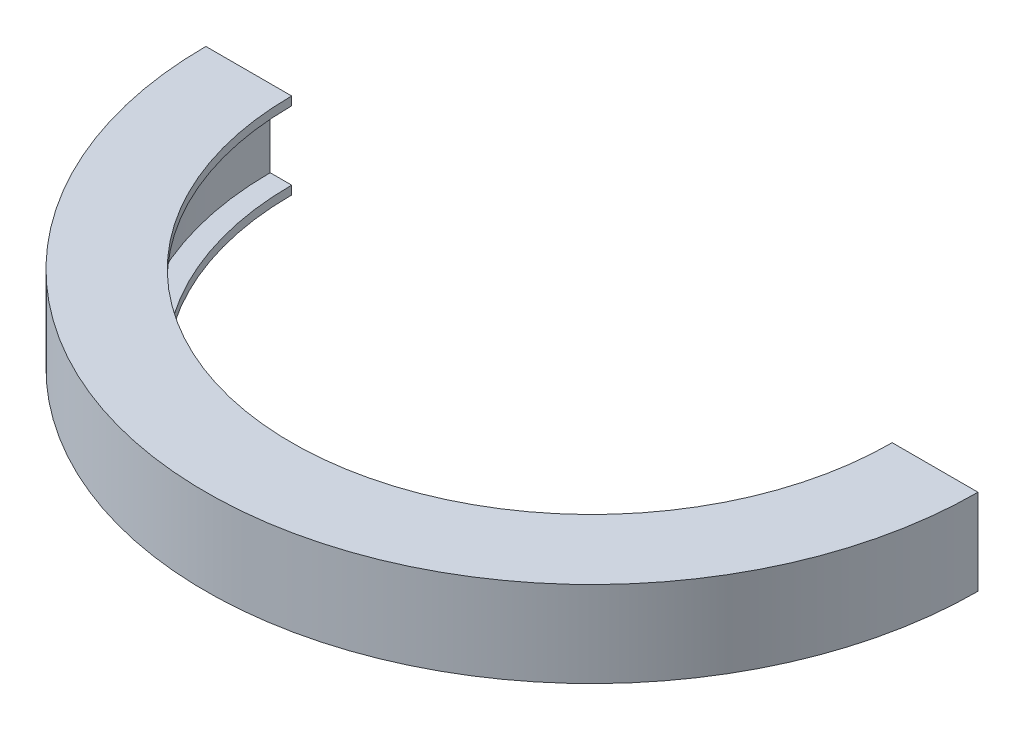
ISO-10303-21;
HEADER;
FILE_DESCRIPTION(('STEP AP214'),'2;1');
FILE_NAME('part.step','',(''),(''),'','','');
FILE_SCHEMA(('AUTOMOTIVE_DESIGN { 1 0 10303 214 1 1 1 1 }'));
ENDSEC;
DATA;
#1=APPLICATION_CONTEXT('core data for automotive mechanical design processes');
#2=APPLICATION_PROTOCOL_DEFINITION('international standard','automotive_design',2000,#1);
#3=PRODUCT_CONTEXT('',#1,'mechanical');
#4=PRODUCT('Part','Part','',(#3));
#5=PRODUCT_RELATED_PRODUCT_CATEGORY('part','',(#4));
#6=PRODUCT_DEFINITION_FORMATION('','',#4);
#7=PRODUCT_DEFINITION_CONTEXT('part definition',#1,'design');
#8=PRODUCT_DEFINITION('design','',#6,#7);
#9=PRODUCT_DEFINITION_SHAPE('','',#8);
#10=(LENGTH_UNIT() NAMED_UNIT(*) SI_UNIT(.MILLI.,.METRE.));
#11=(NAMED_UNIT(*) PLANE_ANGLE_UNIT() SI_UNIT($,.RADIAN.));
#12=(NAMED_UNIT(*) SI_UNIT($,.STERADIAN.) SOLID_ANGLE_UNIT());
#13=UNCERTAINTY_MEASURE_WITH_UNIT(LENGTH_MEASURE(1.E-05),#10,'distance_accuracy_value','');
#14=(GEOMETRIC_REPRESENTATION_CONTEXT(3) GLOBAL_UNCERTAINTY_ASSIGNED_CONTEXT((#13)) GLOBAL_UNIT_ASSIGNED_CONTEXT((#10,
#11,#12)) REPRESENTATION_CONTEXT('',''));
#15=CARTESIAN_POINT('',(0.,0.,0.));
#16=DIRECTION('',(0.,0.,1.));
#17=DIRECTION('',(1.,0.,0.));
#18=AXIS2_PLACEMENT_3D('',#15,#16,#17);
#19=CARTESIAN_POINT('',(0.,10.,0.));
#20=DIRECTION('',(0.,0.,-1.));
#21=DIRECTION('',(-1.,0.,0.));
#22=AXIS2_PLACEMENT_3D('',#19,#20,#21);
#23=PLANE('',#22);
#24=DIRECTION('',(0.,-1.,0.));
#25=VECTOR('',#24,1.);
#26=CARTESIAN_POINT('',(-70.,10.,0.));
#27=LINE('',#26,#25);
#28=CARTESIAN_POINT('',(-70.,10.,0.));
#29=VERTEX_POINT('',#28);
#30=CARTESIAN_POINT('',(-70.,8.,0.));
#31=VERTEX_POINT('',#30);
#32=EDGE_CURVE('E69',#29,#31,#27,.T.);
#33=ORIENTED_EDGE('',*,*,#32,.T.);
#34=DIRECTION('',(-1.,0.,0.));
#35=VECTOR('',#34,1.);
#36=CARTESIAN_POINT('',(0.,8.,0.));
#37=LINE('',#36,#35);
#38=CARTESIAN_POINT('',(-75.,8.,0.));
#39=VERTEX_POINT('',#38);
#40=EDGE_CURVE('E141',#31,#39,#37,.T.);
#41=ORIENTED_EDGE('',*,*,#40,.T.);
#42=DIRECTION('',(0.,1.,0.));
#43=VECTOR('',#42,1.);
#44=CARTESIAN_POINT('',(-75.,5.6359019496972,0.));
#45=LINE('',#44,#43);
#46=CARTESIAN_POINT('',(-75.,-8.,0.));
#47=VERTEX_POINT('',#46);
#48=EDGE_CURVE('E144',#39,#47,#45,.F.);
#49=ORIENTED_EDGE('',*,*,#48,.T.);
#50=DIRECTION('',(1.,0.,0.));
#51=VECTOR('',#50,1.);
#52=CARTESIAN_POINT('',(0.,-8.,0.));
#53=LINE('',#52,#51);
#54=CARTESIAN_POINT('',(-70.,-8.,0.));
#55=VERTEX_POINT('',#54);
#56=EDGE_CURVE('E129',#47,#55,#53,.T.);
#57=ORIENTED_EDGE('',*,*,#56,.T.);
#58=CARTESIAN_POINT('',(-70.,-10.,0.));
#59=VERTEX_POINT('',#58);
#60=EDGE_CURVE('E92',#55,#59,#27,.T.);
#61=ORIENTED_EDGE('',*,*,#60,.T.);
#62=DIRECTION('',(1.,0.,0.));
#63=VECTOR('',#62,1.);
#64=CARTESIAN_POINT('',(0.,-10.,0.));
#65=LINE('',#64,#63);
#66=CARTESIAN_POINT('',(-90.,-10.,0.));
#67=VERTEX_POINT('',#66);
#68=EDGE_CURVE('E146',#67,#59,#65,.T.);
#69=ORIENTED_EDGE('',*,*,#68,.F.);
#70=DIRECTION('',(0.,-1.,0.));
#71=VECTOR('',#70,1.);
#72=CARTESIAN_POINT('',(-90.,10.,0.));
#73=LINE('',#72,#71);
#74=CARTESIAN_POINT('',(-90.,10.,0.));
#75=VERTEX_POINT('',#74);
#76=EDGE_CURVE('E96',#75,#67,#73,.T.);
#77=ORIENTED_EDGE('',*,*,#76,.F.);
#78=DIRECTION('',(1.,0.,0.));
#79=VECTOR('',#78,1.);
#80=CARTESIAN_POINT('',(0.,10.,0.));
#81=LINE('',#80,#79);
#82=EDGE_CURVE('E147',#75,#29,#81,.T.);
#83=ORIENTED_EDGE('',*,*,#82,.T.);
#84=EDGE_LOOP('',(#33,#41,#49,#57,#61,#69,#77,#83));
#85=FACE_BOUND('',#84,.T.);
#86=ADVANCED_FACE('F45',(#85),#23,.T.);
#87=DIRECTION('',(0.,1.,0.));
#88=VECTOR('',#87,1.);
#89=CARTESIAN_POINT('',(75.,5.6359019496972,0.));
#90=LINE('',#89,#88);
#91=CARTESIAN_POINT('',(75.,-8.,0.));
#92=VERTEX_POINT('',#91);
#93=CARTESIAN_POINT('',(75.,8.,0.));
#94=VERTEX_POINT('',#93);
#95=EDGE_CURVE('E11',#92,#94,#90,.T.);
#96=ORIENTED_EDGE('',*,*,#95,.T.);
#97=DIRECTION('',(-1.,0.,0.));
#98=VECTOR('',#97,1.);
#99=CARTESIAN_POINT('',(0.,8.,0.));
#100=LINE('',#99,#98);
#101=CARTESIAN_POINT('',(70.,8.,0.));
#102=VERTEX_POINT('',#101);
#103=EDGE_CURVE('E136',#94,#102,#100,.T.);
#104=ORIENTED_EDGE('',*,*,#103,.T.);
#105=DIRECTION('',(0.,-1.,0.));
#106=VECTOR('',#105,1.);
#107=CARTESIAN_POINT('',(70.,10.,0.));
#108=LINE('',#107,#106);
#109=CARTESIAN_POINT('',(70.,10.,0.));
#110=VERTEX_POINT('',#109);
#111=EDGE_CURVE('E163',#110,#102,#108,.T.);
#112=ORIENTED_EDGE('',*,*,#111,.F.);
#113=CARTESIAN_POINT('',(90.,10.,0.));
#114=VERTEX_POINT('',#113);
#115=EDGE_CURVE('E151',#110,#114,#81,.T.);
#116=ORIENTED_EDGE('',*,*,#115,.T.);
#117=DIRECTION('',(0.,-1.,0.));
#118=VECTOR('',#117,1.);
#119=CARTESIAN_POINT('',(90.,10.,0.));
#120=LINE('',#119,#118);
#121=CARTESIAN_POINT('',(90.,-10.,0.));
#122=VERTEX_POINT('',#121);
#123=EDGE_CURVE('E166',#114,#122,#120,.T.);
#124=ORIENTED_EDGE('',*,*,#123,.T.);
#125=CARTESIAN_POINT('',(70.,-10.,0.));
#126=VERTEX_POINT('',#125);
#127=EDGE_CURVE('E157',#126,#122,#65,.T.);
#128=ORIENTED_EDGE('',*,*,#127,.F.);
#129=CARTESIAN_POINT('',(70.,-8.,0.));
#130=VERTEX_POINT('',#129);
#131=EDGE_CURVE('E134',#130,#126,#108,.T.);
#132=ORIENTED_EDGE('',*,*,#131,.F.);
#133=DIRECTION('',(1.,0.,0.));
#134=VECTOR('',#133,1.);
#135=CARTESIAN_POINT('',(0.,-8.,0.));
#136=LINE('',#135,#134);
#137=EDGE_CURVE('E60',#130,#92,#136,.T.);
#138=ORIENTED_EDGE('',*,*,#137,.T.);
#139=EDGE_LOOP('',(#96,#104,#112,#116,#124,#128,#132,#138));
#140=FACE_BOUND('',#139,.T.);
#141=ADVANCED_FACE('F132',(#140),#23,.T.);
#142=CARTESIAN_POINT('',(0.,10.,0.));
#143=DIRECTION('',(0.,-1.,0.));
#144=DIRECTION('',(0.,0.,-1.));
#145=AXIS2_PLACEMENT_3D('',#142,#143,#144);
#146=CYLINDRICAL_SURFACE('',#145,70.);
#147=ORIENTED_EDGE('',*,*,#111,.T.);
#148=CARTESIAN_POINT('',(0.,8.,0.));
#149=DIRECTION('',(0.,-1.,0.));
#150=DIRECTION('',(0.,0.,-1.));
#151=AXIS2_PLACEMENT_3D('',#148,#149,#150);
#152=CIRCLE('',#151,70.);
#153=EDGE_CURVE('E53',#102,#31,#152,.T.);
#154=ORIENTED_EDGE('',*,*,#153,.T.);
#155=ORIENTED_EDGE('',*,*,#32,.F.);
#156=CARTESIAN_POINT('',(0.,10.,0.));
#157=DIRECTION('',(0.,1.,0.));
#158=DIRECTION('',(0.,0.,1.));
#159=AXIS2_PLACEMENT_3D('',#156,#157,#158);
#160=CIRCLE('',#159,70.);
#161=EDGE_CURVE('E153',#29,#110,#160,.T.);
#162=ORIENTED_EDGE('',*,*,#161,.T.);
#163=EDGE_LOOP('',(#147,#154,#155,#162));
#164=FACE_BOUND('',#163,.T.);
#165=ADVANCED_FACE('F170',(#164),#146,.F.);
#166=ORIENTED_EDGE('',*,*,#60,.F.);
#167=CARTESIAN_POINT('',(0.,-8.,0.));
#168=DIRECTION('',(0.,1.,0.));
#169=DIRECTION('',(0.,0.,1.));
#170=AXIS2_PLACEMENT_3D('',#167,#168,#169);
#171=CIRCLE('',#170,70.);
#172=EDGE_CURVE('E169',#55,#130,#171,.T.);
#173=ORIENTED_EDGE('',*,*,#172,.T.);
#174=ORIENTED_EDGE('',*,*,#131,.T.);
#175=CARTESIAN_POINT('',(0.,-10.,0.));
#176=DIRECTION('',(0.,1.,0.));
#177=DIRECTION('',(0.,0.,1.));
#178=AXIS2_PLACEMENT_3D('',#175,#176,#177);
#179=CIRCLE('',#178,70.);
#180=EDGE_CURVE('E150',#59,#126,#179,.T.);
#181=ORIENTED_EDGE('',*,*,#180,.F.);
#182=EDGE_LOOP('',(#166,#173,#174,#181));
#183=FACE_BOUND('',#182,.T.);
#184=ADVANCED_FACE('F198',(#183),#146,.F.);
#185=CARTESIAN_POINT('',(0.,10.,0.));
#186=DIRECTION('',(0.,-1.,0.));
#187=DIRECTION('',(0.,0.,-1.));
#188=AXIS2_PLACEMENT_3D('',#185,#186,#187);
#189=CYLINDRICAL_SURFACE('',#188,90.);
#190=CARTESIAN_POINT('',(0.,-10.,0.));
#191=DIRECTION('',(0.,1.,0.));
#192=DIRECTION('',(0.,0.,1.));
#193=AXIS2_PLACEMENT_3D('',#190,#191,#192);
#194=CIRCLE('',#193,90.);
#195=EDGE_CURVE('E156',#67,#122,#194,.T.);
#196=ORIENTED_EDGE('',*,*,#195,.T.);
#197=ORIENTED_EDGE('',*,*,#123,.F.);
#198=CARTESIAN_POINT('',(0.,10.,0.));
#199=DIRECTION('',(0.,1.,0.));
#200=DIRECTION('',(0.,0.,1.));
#201=AXIS2_PLACEMENT_3D('',#198,#199,#200);
#202=CIRCLE('',#201,90.);
#203=EDGE_CURVE('E149',#75,#114,#202,.T.);
#204=ORIENTED_EDGE('',*,*,#203,.F.);
#205=ORIENTED_EDGE('',*,*,#76,.T.);
#206=EDGE_LOOP('',(#196,#197,#204,#205));
#207=FACE_BOUND('',#206,.T.);
#208=ADVANCED_FACE('F47',(#207),#189,.T.);
#209=CARTESIAN_POINT('',(0.,10.,0.));
#210=DIRECTION('',(0.,1.,0.));
#211=DIRECTION('',(0.,0.,1.));
#212=AXIS2_PLACEMENT_3D('',#209,#210,#211);
#213=PLANE('',#212);
#214=ORIENTED_EDGE('',*,*,#82,.F.);
#215=ORIENTED_EDGE('',*,*,#203,.T.);
#216=ORIENTED_EDGE('',*,*,#115,.F.);
#217=ORIENTED_EDGE('',*,*,#161,.F.);
#218=EDGE_LOOP('',(#214,#215,#216,#217));
#219=FACE_BOUND('',#218,.T.);
#220=ADVANCED_FACE('F176',(#219),#213,.T.);
#221=CARTESIAN_POINT('',(0.,-10.,0.));
#222=DIRECTION('',(0.,1.,0.));
#223=DIRECTION('',(0.,0.,1.));
#224=AXIS2_PLACEMENT_3D('',#221,#222,#223);
#225=PLANE('',#224);
#226=ORIENTED_EDGE('',*,*,#68,.T.);
#227=ORIENTED_EDGE('',*,*,#180,.T.);
#228=ORIENTED_EDGE('',*,*,#127,.T.);
#229=ORIENTED_EDGE('',*,*,#195,.F.);
#230=EDGE_LOOP('',(#226,#227,#228,#229));
#231=FACE_BOUND('',#230,.T.);
#232=ADVANCED_FACE('F181',(#231),#225,.F.);
#233=CARTESIAN_POINT('',(-70.,8.,0.));
#234=DIRECTION('',(0.,-1.,0.));
#235=DIRECTION('',(0.,0.,-1.));
#236=AXIS2_PLACEMENT_3D('',#233,#234,#235);
#237=PLANE('',#236);
#238=ORIENTED_EDGE('',*,*,#153,.F.);
#239=ORIENTED_EDGE('',*,*,#103,.F.);
#240=CARTESIAN_POINT('',(0.,8.,0.));
#241=DIRECTION('',(0.,1.,0.));
#242=DIRECTION('',(0.,0.,1.));
#243=AXIS2_PLACEMENT_3D('',#240,#241,#242);
#244=CIRCLE('',#243,75.);
#245=EDGE_CURVE('E125',#39,#94,#244,.T.);
#246=ORIENTED_EDGE('',*,*,#245,.F.);
#247=ORIENTED_EDGE('',*,*,#40,.F.);
#248=EDGE_LOOP('',(#238,#239,#246,#247));
#249=FACE_BOUND('',#248,.T.);
#250=ADVANCED_FACE('F179',(#249),#237,.T.);
#251=CARTESIAN_POINT('',(0.,5.6359019496972,0.));
#252=DIRECTION('',(0.,1.,0.));
#253=DIRECTION('',(0.,0.,1.));
#254=AXIS2_PLACEMENT_3D('',#251,#252,#253);
#255=CYLINDRICAL_SURFACE('',#254,75.);
#256=ORIENTED_EDGE('',*,*,#245,.T.);
#257=ORIENTED_EDGE('',*,*,#95,.F.);
#258=CARTESIAN_POINT('',(0.,-8.,0.));
#259=DIRECTION('',(0.,1.,0.));
#260=DIRECTION('',(0.,0.,1.));
#261=AXIS2_PLACEMENT_3D('',#258,#259,#260);
#262=CIRCLE('',#261,75.);
#263=EDGE_CURVE('E122',#47,#92,#262,.T.);
#264=ORIENTED_EDGE('',*,*,#263,.F.);
#265=ORIENTED_EDGE('',*,*,#48,.F.);
#266=EDGE_LOOP('',(#256,#257,#264,#265));
#267=FACE_BOUND('',#266,.T.);
#268=ADVANCED_FACE('F121',(#267),#255,.F.);
#269=CARTESIAN_POINT('',(-70.,-8.,0.));
#270=DIRECTION('',(0.,1.,0.));
#271=DIRECTION('',(0.,0.,1.));
#272=AXIS2_PLACEMENT_3D('',#269,#270,#271);
#273=PLANE('',#272);
#274=ORIENTED_EDGE('',*,*,#263,.T.);
#275=ORIENTED_EDGE('',*,*,#137,.F.);
#276=ORIENTED_EDGE('',*,*,#172,.F.);
#277=ORIENTED_EDGE('',*,*,#56,.F.);
#278=EDGE_LOOP('',(#274,#275,#276,#277));
#279=FACE_BOUND('',#278,.T.);
#280=ADVANCED_FACE('F128',(#279),#273,.T.);
#281=CLOSED_SHELL('',(#86,#141,#165,#184,#208,#220,#232,#250,#268,#280));
#282=MANIFOLD_SOLID_BREP('B2',#281);
#283=ADVANCED_BREP_SHAPE_REPRESENTATION('',(#18,#282),#14);
#284=SHAPE_DEFINITION_REPRESENTATION(#9,#283);
ENDSEC;
END-ISO-10303-21;
